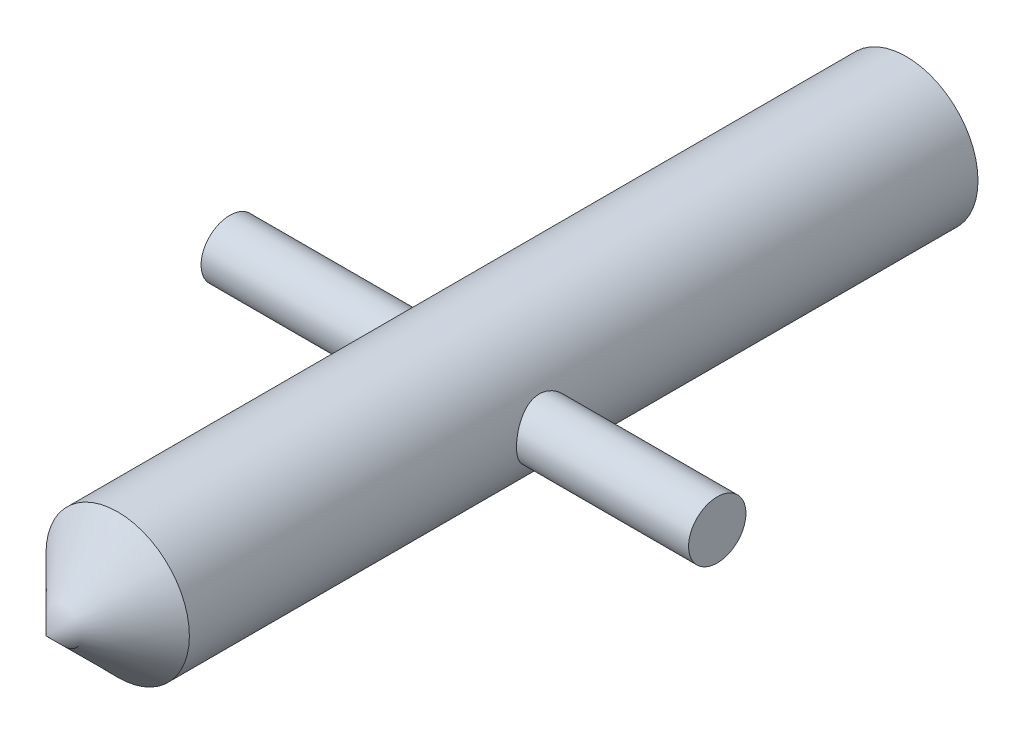
ISO-10303-21;
HEADER;
FILE_DESCRIPTION(('STEP AP214'),'2;1');
FILE_NAME('part.step','',(''),(''),'','','');
FILE_SCHEMA(('AUTOMOTIVE_DESIGN { 1 0 10303 214 1 1 1 1 }'));
ENDSEC;
DATA;
#1=APPLICATION_CONTEXT('core data for automotive mechanical design processes');
#2=APPLICATION_PROTOCOL_DEFINITION('international standard','automotive_design',2000,#1);
#3=PRODUCT_CONTEXT('',#1,'mechanical');
#4=PRODUCT('Part','Part','',(#3));
#5=PRODUCT_RELATED_PRODUCT_CATEGORY('part','',(#4));
#6=PRODUCT_DEFINITION_FORMATION('','',#4);
#7=PRODUCT_DEFINITION_CONTEXT('part definition',#1,'design');
#8=PRODUCT_DEFINITION('design','',#6,#7);
#9=PRODUCT_DEFINITION_SHAPE('','',#8);
#10=(LENGTH_UNIT() NAMED_UNIT(*) SI_UNIT(.MILLI.,.METRE.));
#11=(NAMED_UNIT(*) PLANE_ANGLE_UNIT() SI_UNIT($,.RADIAN.));
#12=(NAMED_UNIT(*) SI_UNIT($,.STERADIAN.) SOLID_ANGLE_UNIT());
#13=UNCERTAINTY_MEASURE_WITH_UNIT(LENGTH_MEASURE(1.E-05),#10,'distance_accuracy_value','');
#14=(GEOMETRIC_REPRESENTATION_CONTEXT(3) GLOBAL_UNCERTAINTY_ASSIGNED_CONTEXT((#13)) GLOBAL_UNIT_ASSIGNED_CONTEXT((#10,
#11,#12)) REPRESENTATION_CONTEXT('',''));
#15=CARTESIAN_POINT('',(0.,0.,0.));
#16=DIRECTION('',(0.,0.,1.));
#17=DIRECTION('',(1.,0.,0.));
#18=AXIS2_PLACEMENT_3D('',#15,#16,#17);
#19=CARTESIAN_POINT('',(0.,0.,60.));
#20=DIRECTION('',(0.,0.,-1.));
#21=DIRECTION('',(-1.,0.,0.));
#22=AXIS2_PLACEMENT_3D('',#19,#20,#21);
#23=CYLINDRICAL_SURFACE('',#22,5.);
#24=CARTESIAN_POINT('',(0.,0.,55.));
#25=DIRECTION('',(0.,0.,1.));
#26=DIRECTION('',(1.,0.,0.));
#27=AXIS2_PLACEMENT_3D('',#24,#25,#26);
#28=CIRCLE('',#27,5.);
#29=CARTESIAN_POINT('',(5.,0.,55.));
#30=VERTEX_POINT('',#29);
#31=EDGE_CURVE('E78',#30,#30,#28,.F.);
#32=ORIENTED_EDGE('',*,*,#31,.T.);
#33=EDGE_LOOP('',(#32));
#34=FACE_BOUND('',#33,.T.);
#35=CARTESIAN_POINT('',(0.,0.,0.));
#36=DIRECTION('',(0.,0.,1.));
#37=DIRECTION('',(1.,0.,0.));
#38=AXIS2_PLACEMENT_3D('',#35,#36,#37);
#39=CIRCLE('',#38,5.);
#40=CARTESIAN_POINT('',(5.,0.,0.));
#41=VERTEX_POINT('',#40);
#42=EDGE_CURVE('E97',#41,#41,#39,.T.);
#43=ORIENTED_EDGE('',*,*,#42,.T.);
#44=EDGE_LOOP('',(#43));
#45=FACE_BOUND('',#44,.T.);
#46=CARTESIAN_POINT('',(5.,0.,32.1847169396152));
#47=CARTESIAN_POINT('',(4.99999271227085,-0.107493005442892,32.1847070877915));
#48=CARTESIAN_POINT('',(4.99649294306932,-0.215172564090673,32.1759991875268));
#49=CARTESIAN_POINT('',(4.98283453100641,-0.427496480417896,32.141469236094));
#50=CARTESIAN_POINT('',(4.97265778698877,-0.532131777561249,32.1156006605291));
#51=CARTESIAN_POINT('',(4.94674209213119,-0.734953922727403,32.0478408615564));
#52=CARTESIAN_POINT('',(4.93102136364072,-0.833160661616958,32.0060020933985));
#53=CARTESIAN_POINT('',(4.89556610796078,-1.02107197032837,31.9076977662887));
#54=CARTESIAN_POINT('',(4.87583297458057,-1.11077947675099,31.8512372846963));
#55=CARTESIAN_POINT('',(4.83330886170419,-1.28350100757039,31.7224814410543));
#56=CARTESIAN_POINT('',(4.81042296929191,-1.36606227255021,31.6496102833749));
#57=CARTESIAN_POINT('',(4.76460576906195,-1.51817500478472,31.4913169361384));
#58=CARTESIAN_POINT('',(4.74167444453792,-1.58772010713353,31.4058886424035));
#59=CARTESIAN_POINT('',(4.69722791797136,-1.71487456729288,31.2202888693729));
#60=CARTESIAN_POINT('',(4.67582115964951,-1.77181498119547,31.119630453592));
#61=CARTESIAN_POINT('',(4.63833647186793,-1.86775471903715,30.9091805411952));
#62=CARTESIAN_POINT('',(4.62225601244176,-1.90676256428584,30.7993934117668));
#63=CARTESIAN_POINT('',(4.59826357660818,-1.96389882339587,30.5790046060231));
#64=CARTESIAN_POINT('',(4.59001420355605,-1.98289396580565,30.468665704039));
#65=CARTESIAN_POINT('',(4.58164004049144,-2.00217296164003,30.2460819413079));
#66=CARTESIAN_POINT('',(4.58151125522768,-2.00246601631323,30.1338380449902));
#67=CARTESIAN_POINT('',(4.58910500279994,-1.98498936750455,29.9189602681572));
#68=CARTESIAN_POINT('',(4.5962817503845,-1.96847531430514,29.8162012252062));
#69=CARTESIAN_POINT('',(4.61676187607836,-1.91994688029782,29.6150573836085));
#70=CARTESIAN_POINT('',(4.63006632321673,-1.88792979480463,29.5166733515049));
#71=CARTESIAN_POINT('',(4.6615948508853,-1.80869473255107,29.3246991034192));
#72=CARTESIAN_POINT('',(4.67991379280788,-1.76117986231532,29.2312477005605));
#73=CARTESIAN_POINT('',(4.7193811638989,-1.65250646073222,29.0533011232536));
#74=CARTESIAN_POINT('',(4.74053065456848,-1.59134280510085,28.9688093302124));
#75=CARTESIAN_POINT('',(4.78526736742271,-1.45155059945444,28.8043072108132));
#76=CARTESIAN_POINT('',(4.80891664976151,-1.37193746297064,28.7251482101692));
#77=CARTESIAN_POINT('',(4.85459824958282,-1.2003144274302,28.5810324616132));
#78=CARTESIAN_POINT('',(4.87663024445325,-1.10830206533444,28.5160785422049));
#79=CARTESIAN_POINT('',(4.91714681264548,-0.912077652605845,28.4010994921994));
#80=CARTESIAN_POINT('',(4.93555270095415,-0.80766049134648,28.3513946584181));
#81=CARTESIAN_POINT('',(4.96614828328759,-0.591023765482885,28.2705490785371));
#82=CARTESIAN_POINT('',(4.97834113462382,-0.478808196849676,28.2393989020578));
#83=CARTESIAN_POINT('',(4.99456139506911,-0.256895887607822,28.1982686441955));
#84=CARTESIAN_POINT('',(4.99902945833514,-0.147443293985536,28.1871444853616));
#85=CARTESIAN_POINT('',(5.00068478510631,0.0718453098078169,28.1830038390866));
#86=CARTESIAN_POINT('',(4.99787393582291,0.181681213223924,28.1899826580677));
#87=CARTESIAN_POINT('',(4.98557567063753,0.393432739121988,28.2210086921672));
#88=CARTESIAN_POINT('',(4.97639391345523,0.495482491775475,28.2442749199662));
#89=CARTESIAN_POINT('',(4.952594414055,0.694135428060781,28.306152647925));
#90=CARTESIAN_POINT('',(4.9379759735653,0.790737910224845,28.3447661192839));
#91=CARTESIAN_POINT('',(4.90416594770812,0.979078785816703,28.4375018792951));
#92=CARTESIAN_POINT('',(4.88484815979803,1.07057802275541,28.4920624116583));
#93=CARTESIAN_POINT('',(4.84373364745525,1.24344359124656,28.6146572635208));
#94=CARTESIAN_POINT('',(4.8219359311027,1.32480584076113,28.6826969825378));
#95=CARTESIAN_POINT('',(4.77645117638112,1.48072304302882,28.8355869525648));
#96=CARTESIAN_POINT('',(4.75273441425052,1.55447393380607,28.9212504811214));
#97=CARTESIAN_POINT('',(4.70741672917132,1.68675119741371,29.1041570226246));
#98=CARTESIAN_POINT('',(4.68581615526511,1.74527506133751,29.2014019399551));
#99=CARTESIAN_POINT('',(4.64714299907708,1.84580750193163,29.4061786342093));
#100=CARTESIAN_POINT('',(4.63011630884788,1.88765059453446,29.5138009388275));
#101=CARTESIAN_POINT('',(4.60323673477931,1.95229621970531,29.7354505913304));
#102=CARTESIAN_POINT('',(4.59337855695998,1.97511280526932,29.8494731454276));
#103=CARTESIAN_POINT('',(4.58271759299926,1.9997156172784,30.0718448413897));
#104=CARTESIAN_POINT('',(4.58131421008171,2.00289708230287,30.1800117792085));
#105=CARTESIAN_POINT('',(4.58614836033098,1.99180315927753,30.3952617973285));
#106=CARTESIAN_POINT('',(4.59238492324793,1.97752998791378,30.5023450135178));
#107=CARTESIAN_POINT('',(4.6112664907902,1.93307136615365,30.7080491294702));
#108=CARTESIAN_POINT('',(4.62364831827449,1.90353749357098,30.8068372140482));
#109=CARTESIAN_POINT('',(4.65324001232696,1.83000544849102,30.9980955692287));
#110=CARTESIAN_POINT('',(4.67045121206007,1.78600328139382,31.090564086515));
#111=CARTESIAN_POINT('',(4.70898609604491,1.68187276275973,31.272326558886));
#112=CARTESIAN_POINT('',(4.73048882313242,1.62096533515949,31.3611356097457));
#113=CARTESIAN_POINT('',(4.77463804372237,1.4858921192715,31.527710256819));
#114=CARTESIAN_POINT('',(4.79728488048406,1.41172233481813,31.6054725117435));
#115=CARTESIAN_POINT('',(4.84293567087394,1.24650550627247,31.7529197928788));
#116=CARTESIAN_POINT('',(4.86586757962185,1.15467600114614,31.8217542465133));
#117=CARTESIAN_POINT('',(4.90800406713717,0.95990032028578,31.9430539822368));
#118=CARTESIAN_POINT('',(4.92720691092906,0.856949004547236,31.9955116517677));
#119=CARTESIAN_POINT('',(4.95939714815861,0.644738062495201,32.0813391548055));
#120=CARTESIAN_POINT('',(4.97249363055028,0.535631618219695,32.1150462631755));
#121=CARTESIAN_POINT('',(4.99144306209366,0.312876546281222,32.1633560605695));
#122=CARTESIAN_POINT('',(4.99731899495638,0.199243525858915,32.1780193763591));
#123=CARTESIAN_POINT('',(4.99975899504136,0.0569122978909324,32.1841123205935));
#124=CARTESIAN_POINT('',(5.00000192969176,0.0284626887407597,32.1847195482444));
#125=CARTESIAN_POINT('',(5.,0.,32.1847169396152));
#126=B_SPLINE_CURVE_WITH_KNOTS('',3,(#46,#47,#48,#49,#50,#51,#52,#53,#54,#55,#56,#57,#58,#59,
#60,#61,#62,#63,#64,#65,#66,#67,#68,#69,#70,#71,#72,#73,#74,#75,#76,#77,#78,#79,#80,#81,#82,#83,
#84,#85,#86,#87,#88,#89,#90,#91,#92,#93,#94,#95,#96,#97,#98,#99,#100,#101,#102,#103,#104,#105,
#106,#107,#108,#109,#110,#111,#112,#113,#114,#115,#116,#117,#118,#119,#120,#121,#122,#123,#124,
#125),.UNSPECIFIED.,.T.,.F.,(4,2,2,2,2,2,2,2,2,2,2,2,2,2,2,2,2,2,2,2,2,2,2,2,2,2,2,2,2,2,2,2,2,
2,2,2,2,2,2,4),(0.,0.322402987893072,0.645683636007934,0.967911457471579,1.29002753567984,
1.62597381700397,1.96208394934411,2.31315258819217,2.66405423118268,2.99904105308829,
3.33386306340488,3.64538328401373,3.95695787256048,4.27489126298817,4.59294421938184,
4.93558349186557,5.27829092839734,5.62776913162807,5.97706956113791,6.30569184528008,
6.63422893570083,6.94800455564367,7.26182048993797,7.58523513398264,7.9087795949897,
8.25368474624415,8.59864669043749,8.94695045140829,9.29499672645935,9.61799673392749,
9.94095572563047,10.2511431854877,10.5614163580516,10.8894546805669,11.2175920134839,
11.5670042353384,11.9165786364053,12.2596430101332,12.6016125240434,12.686980458968),.UNSPECIFIED.);
#127=CARTESIAN_POINT('',(5.,0.,32.1847169396152));
#128=VERTEX_POINT('',#127);
#129=EDGE_CURVE('E49',#128,#128,#126,.T.);
#130=ORIENTED_EDGE('',*,*,#129,.F.);
#131=EDGE_LOOP('',(#130));
#132=FACE_BOUND('',#131,.T.);
#133=CARTESIAN_POINT('',(-5.,0.,32.1847169396152));
#134=CARTESIAN_POINT('',(-4.99999271227085,0.107493005442892,32.1847070877915));
#135=CARTESIAN_POINT('',(-4.99649294306932,0.215172564090673,32.1759991875268));
#136=CARTESIAN_POINT('',(-4.98283453100641,0.427496480417896,32.141469236094));
#137=CARTESIAN_POINT('',(-4.97265778698877,0.532131777561249,32.1156006605291));
#138=CARTESIAN_POINT('',(-4.94674209213119,0.734953922727403,32.0478408615564));
#139=CARTESIAN_POINT('',(-4.93102136364072,0.833160661616958,32.0060020933985));
#140=CARTESIAN_POINT('',(-4.89556610796078,1.02107197032837,31.9076977662887));
#141=CARTESIAN_POINT('',(-4.87583297458057,1.11077947675099,31.8512372846963));
#142=CARTESIAN_POINT('',(-4.83330886170419,1.28350100757039,31.7224814410543));
#143=CARTESIAN_POINT('',(-4.81042296929191,1.36606227255021,31.6496102833749));
#144=CARTESIAN_POINT('',(-4.76460576906195,1.51817500478472,31.4913169361384));
#145=CARTESIAN_POINT('',(-4.74167444453792,1.58772010713353,31.4058886424035));
#146=CARTESIAN_POINT('',(-4.69722791797136,1.71487456729288,31.2202888693729));
#147=CARTESIAN_POINT('',(-4.67582115964951,1.77181498119547,31.119630453592));
#148=CARTESIAN_POINT('',(-4.63833647186793,1.86775471903715,30.9091805411952));
#149=CARTESIAN_POINT('',(-4.62225601244176,1.90676256428584,30.7993934117668));
#150=CARTESIAN_POINT('',(-4.59826357660818,1.96389882339587,30.5790046060231));
#151=CARTESIAN_POINT('',(-4.59001420355605,1.98289396580565,30.468665704039));
#152=CARTESIAN_POINT('',(-4.58164004049144,2.00217296164003,30.2460819413079));
#153=CARTESIAN_POINT('',(-4.58151125522768,2.00246601631323,30.1338380449902));
#154=CARTESIAN_POINT('',(-4.58910500279994,1.98498936750455,29.9189602681572));
#155=CARTESIAN_POINT('',(-4.5962817503845,1.96847531430514,29.8162012252062));
#156=CARTESIAN_POINT('',(-4.61676187607836,1.91994688029782,29.6150573836085));
#157=CARTESIAN_POINT('',(-4.63006632321673,1.88792979480463,29.5166733515049));
#158=CARTESIAN_POINT('',(-4.6615948508853,1.80869473255107,29.3246991034192));
#159=CARTESIAN_POINT('',(-4.67991379280788,1.76117986231532,29.2312477005605));
#160=CARTESIAN_POINT('',(-4.7193811638989,1.65250646073222,29.0533011232536));
#161=CARTESIAN_POINT('',(-4.74053065456848,1.59134280510085,28.9688093302124));
#162=CARTESIAN_POINT('',(-4.78526736742271,1.45155059945444,28.8043072108132));
#163=CARTESIAN_POINT('',(-4.80891664976151,1.37193746297064,28.7251482101692));
#164=CARTESIAN_POINT('',(-4.85459824958282,1.2003144274302,28.5810324616132));
#165=CARTESIAN_POINT('',(-4.87663024445325,1.10830206533444,28.5160785422049));
#166=CARTESIAN_POINT('',(-4.91714681264548,0.912077652605845,28.4010994921994));
#167=CARTESIAN_POINT('',(-4.93555270095415,0.80766049134648,28.3513946584181));
#168=CARTESIAN_POINT('',(-4.96614828328759,0.591023765482885,28.2705490785371));
#169=CARTESIAN_POINT('',(-4.97834113462382,0.478808196849676,28.2393989020578));
#170=CARTESIAN_POINT('',(-4.99456139506911,0.256895887607822,28.1982686441955));
#171=CARTESIAN_POINT('',(-4.99902945833514,0.147443293985536,28.1871444853616));
#172=CARTESIAN_POINT('',(-5.00068478510631,-0.0718453098078169,28.1830038390866));
#173=CARTESIAN_POINT('',(-4.99787393582291,-0.181681213223924,28.1899826580677));
#174=CARTESIAN_POINT('',(-4.98557567063753,-0.393432739121988,28.2210086921672));
#175=CARTESIAN_POINT('',(-4.97639391345523,-0.495482491775475,28.2442749199662));
#176=CARTESIAN_POINT('',(-4.952594414055,-0.694135428060781,28.306152647925));
#177=CARTESIAN_POINT('',(-4.9379759735653,-0.790737910224845,28.3447661192839));
#178=CARTESIAN_POINT('',(-4.90416594770812,-0.979078785816703,28.4375018792951));
#179=CARTESIAN_POINT('',(-4.88484815979803,-1.07057802275541,28.4920624116583));
#180=CARTESIAN_POINT('',(-4.84373364745525,-1.24344359124656,28.6146572635208));
#181=CARTESIAN_POINT('',(-4.8219359311027,-1.32480584076113,28.6826969825378));
#182=CARTESIAN_POINT('',(-4.77645117638112,-1.48072304302882,28.8355869525648));
#183=CARTESIAN_POINT('',(-4.75273441425052,-1.55447393380607,28.9212504811214));
#184=CARTESIAN_POINT('',(-4.70741672917132,-1.68675119741371,29.1041570226246));
#185=CARTESIAN_POINT('',(-4.68581615526511,-1.74527506133751,29.2014019399551));
#186=CARTESIAN_POINT('',(-4.64714299907708,-1.84580750193163,29.4061786342093));
#187=CARTESIAN_POINT('',(-4.63011630884788,-1.88765059453446,29.5138009388275));
#188=CARTESIAN_POINT('',(-4.60323673477931,-1.95229621970531,29.7354505913304));
#189=CARTESIAN_POINT('',(-4.59337855695998,-1.97511280526932,29.8494731454276));
#190=CARTESIAN_POINT('',(-4.58271759299926,-1.9997156172784,30.0718448413897));
#191=CARTESIAN_POINT('',(-4.58131421008171,-2.00289708230287,30.1800117792085));
#192=CARTESIAN_POINT('',(-4.58614836033098,-1.99180315927753,30.3952617973285));
#193=CARTESIAN_POINT('',(-4.59238492324793,-1.97752998791378,30.5023450135178));
#194=CARTESIAN_POINT('',(-4.6112664907902,-1.93307136615365,30.7080491294702));
#195=CARTESIAN_POINT('',(-4.62364831827449,-1.90353749357098,30.8068372140482));
#196=CARTESIAN_POINT('',(-4.65324001232696,-1.83000544849102,30.9980955692287));
#197=CARTESIAN_POINT('',(-4.67045121206007,-1.78600328139382,31.090564086515));
#198=CARTESIAN_POINT('',(-4.70898609604491,-1.68187276275973,31.272326558886));
#199=CARTESIAN_POINT('',(-4.73048882313242,-1.62096533515949,31.3611356097457));
#200=CARTESIAN_POINT('',(-4.77463804372237,-1.4858921192715,31.527710256819));
#201=CARTESIAN_POINT('',(-4.79728488048406,-1.41172233481813,31.6054725117435));
#202=CARTESIAN_POINT('',(-4.84293567087394,-1.24650550627247,31.7529197928788));
#203=CARTESIAN_POINT('',(-4.86586757962185,-1.15467600114614,31.8217542465133));
#204=CARTESIAN_POINT('',(-4.90800406713717,-0.95990032028578,31.9430539822368));
#205=CARTESIAN_POINT('',(-4.92720691092906,-0.856949004547236,31.9955116517677));
#206=CARTESIAN_POINT('',(-4.95939714815861,-0.644738062495201,32.0813391548055));
#207=CARTESIAN_POINT('',(-4.97249363055028,-0.535631618219695,32.1150462631755));
#208=CARTESIAN_POINT('',(-4.99144306209366,-0.312876546281222,32.1633560605695));
#209=CARTESIAN_POINT('',(-4.99731899495638,-0.199243525858915,32.1780193763591));
#210=CARTESIAN_POINT('',(-4.99975899504136,-0.0569122978909324,32.1841123205935));
#211=CARTESIAN_POINT('',(-5.00000192969176,-0.0284626887407597,32.1847195482444));
#212=CARTESIAN_POINT('',(-5.,0.,32.1847169396152));
#213=B_SPLINE_CURVE_WITH_KNOTS('',3,(#133,#134,#135,#136,#137,#138,#139,#140,#141,#142,#143,
#144,#145,#146,#147,#148,#149,#150,#151,#152,#153,#154,#155,#156,#157,#158,#159,#160,#161,#162,
#163,#164,#165,#166,#167,#168,#169,#170,#171,#172,#173,#174,#175,#176,#177,#178,#179,#180,#181,
#182,#183,#184,#185,#186,#187,#188,#189,#190,#191,#192,#193,#194,#195,#196,#197,#198,#199,#200,
#201,#202,#203,#204,#205,#206,#207,#208,#209,#210,#211,#212),.UNSPECIFIED.,.T.,.F.,(4,2,2,2,2,2,
2,2,2,2,2,2,2,2,2,2,2,2,2,2,2,2,2,2,2,2,2,2,2,2,2,2,2,2,2,2,2,2,2,4),(0.,0.322402987893072,
0.645683636007934,0.967911457471579,1.29002753567984,1.62597381700397,1.96208394934411,
2.31315258819217,2.66405423118268,2.99904105308829,3.33386306340488,3.64538328401373,
3.95695787256048,4.27489126298817,4.59294421938184,4.93558349186557,5.27829092839734,
5.62776913162807,5.97706956113791,6.30569184528008,6.63422893570083,6.94800455564367,
7.26182048993797,7.58523513398264,7.9087795949897,8.25368474624415,8.59864669043749,
8.94695045140829,9.29499672645935,9.61799673392749,9.94095572563047,10.2511431854877,
10.5614163580516,10.8894546805669,11.2175920134839,11.5670042353384,11.9165786364053,
12.2596430101332,12.6016125240434,12.686980458968),.UNSPECIFIED.);
#214=CARTESIAN_POINT('',(-5.,0.,32.1847169396152));
#215=VERTEX_POINT('',#214);
#216=EDGE_CURVE('E11',#215,#215,#213,.T.);
#217=ORIENTED_EDGE('',*,*,#216,.F.);
#218=EDGE_LOOP('',(#217));
#219=FACE_BOUND('',#218,.T.);
#220=ADVANCED_FACE('F39',(#34,#45,#132,#219),#23,.T.);
#221=CARTESIAN_POINT('',(0.,0.,0.));
#222=DIRECTION('',(0.,0.,1.));
#223=DIRECTION('',(1.,0.,0.));
#224=AXIS2_PLACEMENT_3D('',#221,#222,#223);
#225=PLANE('',#224);
#226=ORIENTED_EDGE('',*,*,#42,.F.);
#227=EDGE_LOOP('',(#226));
#228=FACE_BOUND('',#227,.T.);
#229=ADVANCED_FACE('F54',(#228),#225,.F.);
#230=CARTESIAN_POINT('',(0.,0.,55.));
#231=DIRECTION('',(0.,0.,-1.));
#232=DIRECTION('',(-1.,0.,0.));
#233=AXIS2_PLACEMENT_3D('',#230,#231,#232);
#234=CONICAL_SURFACE('',#233,5.,0.785398163397447);
#235=ORIENTED_EDGE('',*,*,#31,.F.);
#236=EDGE_LOOP('',(#235));
#237=FACE_BOUND('',#236,.T.);
#238=CARTESIAN_POINT('',(0.,0.,60.));
#239=VERTEX_POINT('',#238);
#240=VERTEX_LOOP('',#239);
#241=FACE_BOUND('',#240,.T.);
#242=ADVANCED_FACE('F41',(#237,#241),#234,.T.);
#243=CARTESIAN_POINT('',(17.,0.,30.1847169396152));
#244=DIRECTION('',(1.,0.,0.));
#245=DIRECTION('',(0.,0.,-1.));
#246=AXIS2_PLACEMENT_3D('',#243,#244,#245);
#247=PLANE('',#246);
#248=CARTESIAN_POINT('',(17.,0.,30.1847169396152));
#249=DIRECTION('',(1.,0.,0.));
#250=DIRECTION('',(0.,0.,-1.));
#251=AXIS2_PLACEMENT_3D('',#248,#249,#250);
#252=CIRCLE('',#251,2.);
#253=CARTESIAN_POINT('',(17.,0.,28.1847169396152));
#254=VERTEX_POINT('',#253);
#255=EDGE_CURVE('E94',#254,#254,#252,.T.);
#256=ORIENTED_EDGE('',*,*,#255,.T.);
#257=EDGE_LOOP('',(#256));
#258=FACE_BOUND('',#257,.T.);
#259=ADVANCED_FACE('F53',(#258),#247,.T.);
#260=CARTESIAN_POINT('',(17.,0.,30.1847169396152));
#261=DIRECTION('',(-1.,0.,0.));
#262=DIRECTION('',(0.,0.,1.));
#263=AXIS2_PLACEMENT_3D('',#260,#261,#262);
#264=CYLINDRICAL_SURFACE('',#263,2.);
#265=ORIENTED_EDGE('',*,*,#255,.F.);
#266=EDGE_LOOP('',(#265));
#267=FACE_BOUND('',#266,.T.);
#268=ORIENTED_EDGE('',*,*,#129,.T.);
#269=EDGE_LOOP('',(#268));
#270=FACE_BOUND('',#269,.T.);
#271=ADVANCED_FACE('F60',(#267,#270),#264,.T.);
#272=CARTESIAN_POINT('',(-17.,0.,30.1847169396152));
#273=DIRECTION('',(1.,0.,0.));
#274=DIRECTION('',(0.,0.,-1.));
#275=AXIS2_PLACEMENT_3D('',#272,#273,#274);
#276=CIRCLE('',#275,2.);
#277=CARTESIAN_POINT('',(-17.,0.,28.1847169396152));
#278=VERTEX_POINT('',#277);
#279=EDGE_CURVE('E93',#278,#278,#276,.T.);
#280=ORIENTED_EDGE('',*,*,#279,.T.);
#281=EDGE_LOOP('',(#280));
#282=FACE_BOUND('',#281,.T.);
#283=ORIENTED_EDGE('',*,*,#216,.T.);
#284=EDGE_LOOP('',(#283));
#285=FACE_BOUND('',#284,.T.);
#286=ADVANCED_FACE('F80',(#282,#285),#264,.T.);
#287=CARTESIAN_POINT('',(-17.,0.,30.1847169396152));
#288=DIRECTION('',(1.,0.,0.));
#289=DIRECTION('',(0.,0.,-1.));
#290=AXIS2_PLACEMENT_3D('',#287,#288,#289);
#291=PLANE('',#290);
#292=ORIENTED_EDGE('',*,*,#279,.F.);
#293=EDGE_LOOP('',(#292));
#294=FACE_BOUND('',#293,.T.);
#295=ADVANCED_FACE('F84',(#294),#291,.F.);
#296=CLOSED_SHELL('',(#220,#229,#242,#259,#271,#286,#295));
#297=MANIFOLD_SOLID_BREP('B2',#296);
#298=ADVANCED_BREP_SHAPE_REPRESENTATION('',(#18,#297),#14);
#299=SHAPE_DEFINITION_REPRESENTATION(#9,#298);
ENDSEC;
END-ISO-10303-21;
